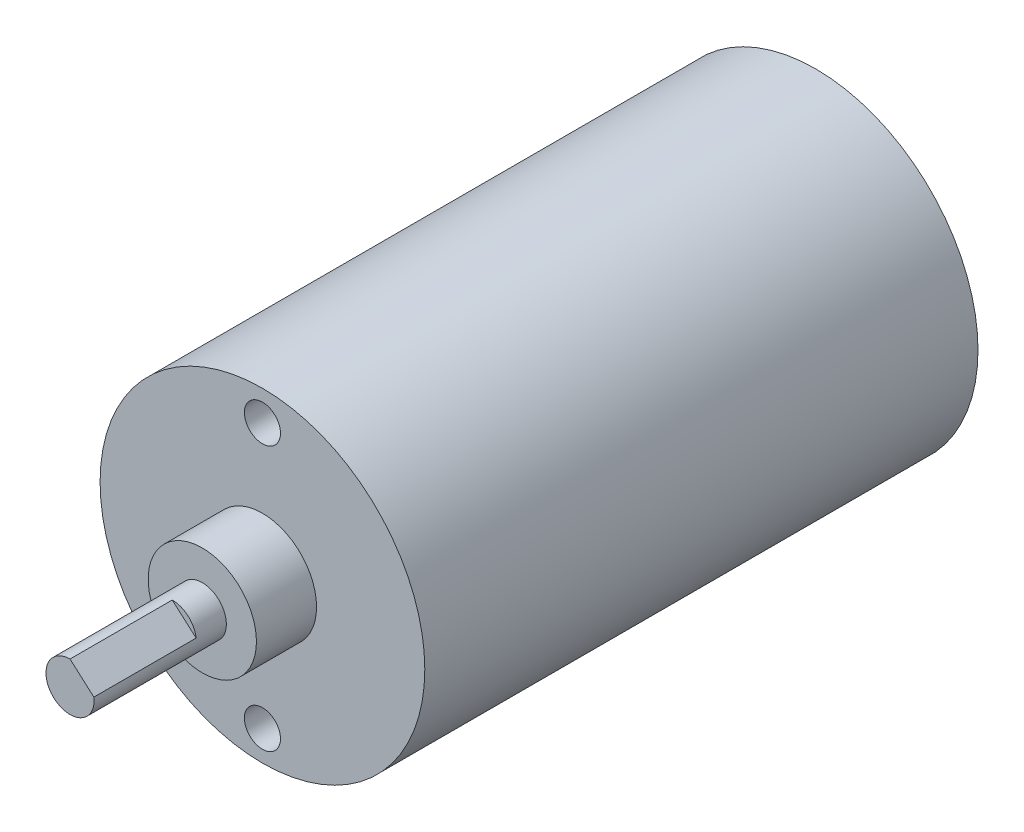
ISO-10303-21;
HEADER;
FILE_DESCRIPTION(('STEP AP214'),'2;1');
FILE_NAME('part.step','',(''),(''),'','','');
FILE_SCHEMA(('AUTOMOTIVE_DESIGN { 1 0 10303 214 1 1 1 1 }'));
ENDSEC;
DATA;
#1=APPLICATION_CONTEXT('core data for automotive mechanical design processes');
#2=APPLICATION_PROTOCOL_DEFINITION('international standard','automotive_design',2000,#1);
#3=PRODUCT_CONTEXT('',#1,'mechanical');
#4=PRODUCT('Part','Part','',(#3));
#5=PRODUCT_RELATED_PRODUCT_CATEGORY('part','',(#4));
#6=PRODUCT_DEFINITION_FORMATION('','',#4);
#7=PRODUCT_DEFINITION_CONTEXT('part definition',#1,'design');
#8=PRODUCT_DEFINITION('design','',#6,#7);
#9=PRODUCT_DEFINITION_SHAPE('','',#8);
#10=(LENGTH_UNIT() NAMED_UNIT(*) SI_UNIT(.MILLI.,.METRE.));
#11=(NAMED_UNIT(*) PLANE_ANGLE_UNIT() SI_UNIT($,.RADIAN.));
#12=(NAMED_UNIT(*) SI_UNIT($,.STERADIAN.) SOLID_ANGLE_UNIT());
#13=UNCERTAINTY_MEASURE_WITH_UNIT(LENGTH_MEASURE(1.E-05),#10,'distance_accuracy_value','');
#14=(GEOMETRIC_REPRESENTATION_CONTEXT(3) GLOBAL_UNCERTAINTY_ASSIGNED_CONTEXT((#13)) GLOBAL_UNIT_ASSIGNED_CONTEXT((#10,
#11,#12)) REPRESENTATION_CONTEXT('',''));
#15=CARTESIAN_POINT('',(0.,0.,0.));
#16=DIRECTION('',(0.,0.,1.));
#17=DIRECTION('',(1.,0.,0.));
#18=AXIS2_PLACEMENT_3D('',#15,#16,#17);
#19=CARTESIAN_POINT('',(0.,0.,53.5));
#20=DIRECTION('',(0.,0.,1.));
#21=DIRECTION('',(1.,0.,0.));
#22=AXIS2_PLACEMENT_3D('',#19,#20,#21);
#23=PLANE('',#22);
#24=CARTESIAN_POINT('',(0.,0.,53.5));
#25=DIRECTION('',(0.,0.,1.));
#26=DIRECTION('',(1.,0.,0.));
#27=AXIS2_PLACEMENT_3D('',#24,#25,#26);
#28=CIRCLE('',#27,2.);
#29=CARTESIAN_POINT('',(1.98431348329844,0.25,53.5));
#30=VERTEX_POINT('',#29);
#31=CARTESIAN_POINT('',(0.,2.,53.5));
#32=VERTEX_POINT('',#31);
#33=EDGE_CURVE('E80',#30,#32,#28,.T.);
#34=ORIENTED_EDGE('',*,*,#33,.T.);
#35=DIRECTION('',(0.75,-0.661437827766148,0.));
#36=VECTOR('',#35,1.);
#37=CARTESIAN_POINT('',(0.992156741649222,1.125,53.5));
#38=LINE('',#37,#36);
#39=EDGE_CURVE('E83',#32,#30,#38,.T.);
#40=ORIENTED_EDGE('',*,*,#39,.T.);
#41=EDGE_LOOP('',(#34,#40));
#42=FACE_BOUND('',#41,.T.);
#43=ADVANCED_FACE('F43',(#42),#23,.T.);
#44=CARTESIAN_POINT('',(0.,0.,46.));
#45=DIRECTION('',(0.,0.,-1.));
#46=DIRECTION('',(-1.,0.,0.));
#47=AXIS2_PLACEMENT_3D('',#44,#45,#46);
#48=CYLINDRICAL_SURFACE('',#47,13.5);
#49=CARTESIAN_POINT('',(0.,0.,46.));
#50=DIRECTION('',(0.,0.,1.));
#51=DIRECTION('',(1.,0.,0.));
#52=AXIS2_PLACEMENT_3D('',#49,#50,#51);
#53=CIRCLE('',#52,13.5);
#54=CARTESIAN_POINT('',(13.5,0.,46.));
#55=VERTEX_POINT('',#54);
#56=EDGE_CURVE('E100',#55,#55,#53,.T.);
#57=ORIENTED_EDGE('',*,*,#56,.F.);
#58=EDGE_LOOP('',(#57));
#59=FACE_BOUND('',#58,.T.);
#60=CARTESIAN_POINT('',(0.,0.,0.));
#61=DIRECTION('',(0.,0.,1.));
#62=DIRECTION('',(1.,0.,0.));
#63=AXIS2_PLACEMENT_3D('',#60,#61,#62);
#64=CIRCLE('',#63,13.5);
#65=CARTESIAN_POINT('',(13.5,0.,0.));
#66=VERTEX_POINT('',#65);
#67=EDGE_CURVE('E47',#66,#66,#64,.T.);
#68=ORIENTED_EDGE('',*,*,#67,.T.);
#69=EDGE_LOOP('',(#68));
#70=FACE_BOUND('',#69,.T.);
#71=ADVANCED_FACE('F45',(#59,#70),#48,.T.);
#72=CARTESIAN_POINT('',(0.,0.,46.));
#73=DIRECTION('',(0.,0.,1.));
#74=DIRECTION('',(1.,0.,0.));
#75=AXIS2_PLACEMENT_3D('',#72,#73,#74);
#76=PLANE('',#75);
#77=CARTESIAN_POINT('',(0.,11.,46.));
#78=DIRECTION('',(0.,0.,1.));
#79=DIRECTION('',(1.,0.,0.));
#80=AXIS2_PLACEMENT_3D('',#77,#78,#79);
#81=CIRCLE('',#80,1.5);
#82=CARTESIAN_POINT('',(1.5,11.,46.));
#83=VERTEX_POINT('',#82);
#84=EDGE_CURVE('E270',#83,#83,#81,.T.);
#85=ORIENTED_EDGE('',*,*,#84,.F.);
#86=EDGE_LOOP('',(#85));
#87=FACE_BOUND('',#86,.T.);
#88=CARTESIAN_POINT('',(0.,-11.,46.));
#89=DIRECTION('',(0.,0.,1.));
#90=DIRECTION('',(1.,0.,0.));
#91=AXIS2_PLACEMENT_3D('',#88,#89,#90);
#92=CIRCLE('',#91,1.5);
#93=CARTESIAN_POINT('',(1.5,-11.,46.));
#94=VERTEX_POINT('',#93);
#95=EDGE_CURVE('E274',#94,#94,#92,.T.);
#96=ORIENTED_EDGE('',*,*,#95,.F.);
#97=EDGE_LOOP('',(#96));
#98=FACE_BOUND('',#97,.T.);
#99=CARTESIAN_POINT('',(0.,0.,46.));
#100=DIRECTION('',(0.,0.,1.));
#101=DIRECTION('',(1.,0.,0.));
#102=AXIS2_PLACEMENT_3D('',#99,#100,#101);
#103=CIRCLE('',#102,4.5);
#104=CARTESIAN_POINT('',(4.5,0.,46.));
#105=VERTEX_POINT('',#104);
#106=EDGE_CURVE('E53',#105,#105,#103,.T.);
#107=ORIENTED_EDGE('',*,*,#106,.F.);
#108=EDGE_LOOP('',(#107));
#109=FACE_BOUND('',#108,.T.);
#110=ORIENTED_EDGE('',*,*,#56,.T.);
#111=EDGE_LOOP('',(#110));
#112=FACE_BOUND('',#111,.T.);
#113=ADVANCED_FACE('F113',(#87,#98,#109,#112),#76,.T.);
#114=CARTESIAN_POINT('',(0.,0.,0.));
#115=DIRECTION('',(0.,0.,1.));
#116=DIRECTION('',(1.,0.,0.));
#117=AXIS2_PLACEMENT_3D('',#114,#115,#116);
#118=PLANE('',#117);
#119=ORIENTED_EDGE('',*,*,#67,.F.);
#120=EDGE_LOOP('',(#119));
#121=FACE_BOUND('',#120,.T.);
#122=ADVANCED_FACE('F110',(#121),#118,.F.);
#123=CARTESIAN_POINT('',(0.,0.,51.));
#124=DIRECTION('',(0.,0.,-1.));
#125=DIRECTION('',(-1.,0.,0.));
#126=AXIS2_PLACEMENT_3D('',#123,#124,#125);
#127=CYLINDRICAL_SURFACE('',#126,4.5);
#128=CARTESIAN_POINT('',(0.,0.,51.));
#129=DIRECTION('',(0.,0.,1.));
#130=DIRECTION('',(1.,0.,0.));
#131=AXIS2_PLACEMENT_3D('',#128,#129,#130);
#132=CIRCLE('',#131,4.5);
#133=CARTESIAN_POINT('',(4.5,0.,51.));
#134=VERTEX_POINT('',#133);
#135=EDGE_CURVE('E91',#134,#134,#132,.T.);
#136=ORIENTED_EDGE('',*,*,#135,.F.);
#137=EDGE_LOOP('',(#136));
#138=FACE_BOUND('',#137,.T.);
#139=ORIENTED_EDGE('',*,*,#106,.T.);
#140=EDGE_LOOP('',(#139));
#141=FACE_BOUND('',#140,.T.);
#142=ADVANCED_FACE('F112',(#138,#141),#127,.T.);
#143=CARTESIAN_POINT('',(0.,0.,51.));
#144=DIRECTION('',(0.,0.,1.));
#145=DIRECTION('',(1.,0.,0.));
#146=AXIS2_PLACEMENT_3D('',#143,#144,#145);
#147=PLANE('',#146);
#148=CARTESIAN_POINT('',(0.,0.,51.));
#149=DIRECTION('',(0.,0.,1.));
#150=DIRECTION('',(1.,0.,0.));
#151=AXIS2_PLACEMENT_3D('',#148,#149,#150);
#152=CIRCLE('',#151,2.);
#153=CARTESIAN_POINT('',(2.,0.,51.));
#154=VERTEX_POINT('',#153);
#155=EDGE_CURVE('E11',#154,#154,#152,.T.);
#156=ORIENTED_EDGE('',*,*,#155,.F.);
#157=EDGE_LOOP('',(#156));
#158=FACE_BOUND('',#157,.T.);
#159=ORIENTED_EDGE('',*,*,#135,.T.);
#160=EDGE_LOOP('',(#159));
#161=FACE_BOUND('',#160,.T.);
#162=ADVANCED_FACE('F118',(#158,#161),#147,.T.);
#163=CARTESIAN_POINT('',(0.,0.,53.5));
#164=DIRECTION('',(0.,0.,-1.));
#165=DIRECTION('',(-1.,0.,0.));
#166=AXIS2_PLACEMENT_3D('',#163,#164,#165);
#167=CYLINDRICAL_SURFACE('',#166,2.);
#168=ORIENTED_EDGE('',*,*,#33,.F.);
#169=DIRECTION('',(0.,0.,-1.));
#170=VECTOR('',#169,1.);
#171=CARTESIAN_POINT('',(1.98431348329844,0.25,62.));
#172=LINE('',#171,#170);
#173=CARTESIAN_POINT('',(1.98431348329844,0.25,62.));
#174=VERTEX_POINT('',#173);
#175=EDGE_CURVE('E61',#174,#30,#172,.T.);
#176=ORIENTED_EDGE('',*,*,#175,.F.);
#177=CARTESIAN_POINT('',(0.,0.,62.));
#178=DIRECTION('',(0.,0.,1.));
#179=DIRECTION('',(1.,0.,0.));
#180=AXIS2_PLACEMENT_3D('',#177,#178,#179);
#181=CIRCLE('',#180,2.);
#182=CARTESIAN_POINT('',(0.,2.,62.));
#183=VERTEX_POINT('',#182);
#184=EDGE_CURVE('E69',#183,#174,#181,.T.);
#185=ORIENTED_EDGE('',*,*,#184,.F.);
#186=DIRECTION('',(0.,0.,-1.));
#187=VECTOR('',#186,1.);
#188=CARTESIAN_POINT('',(0.,2.,62.));
#189=LINE('',#188,#187);
#190=EDGE_CURVE('E76',#183,#32,#189,.T.);
#191=ORIENTED_EDGE('',*,*,#190,.T.);
#192=EDGE_LOOP('',(#168,#176,#185,#191));
#193=FACE_BOUND('',#192,.T.);
#194=ORIENTED_EDGE('',*,*,#155,.T.);
#195=EDGE_LOOP('',(#194));
#196=FACE_BOUND('',#195,.T.);
#197=ADVANCED_FACE('F77',(#193,#196),#167,.T.);
#198=CARTESIAN_POINT('',(0.992156741649222,1.125,62.));
#199=DIRECTION('',(0.661437827766148,0.75,0.));
#200=DIRECTION('',(-0.75,0.661437827766148,0.));
#201=AXIS2_PLACEMENT_3D('',#198,#199,#200);
#202=PLANE('',#201);
#203=ORIENTED_EDGE('',*,*,#39,.F.);
#204=ORIENTED_EDGE('',*,*,#190,.F.);
#205=DIRECTION('',(0.75,-0.661437827766148,0.));
#206=VECTOR('',#205,1.);
#207=CARTESIAN_POINT('',(0.992156741649222,1.125,62.));
#208=LINE('',#207,#206);
#209=EDGE_CURVE('E87',#183,#174,#208,.T.);
#210=ORIENTED_EDGE('',*,*,#209,.T.);
#211=ORIENTED_EDGE('',*,*,#175,.T.);
#212=EDGE_LOOP('',(#203,#204,#210,#211));
#213=FACE_BOUND('',#212,.T.);
#214=ADVANCED_FACE('F84',(#213),#202,.T.);
#215=CARTESIAN_POINT('',(0.,0.,62.));
#216=DIRECTION('',(0.,0.,1.));
#217=DIRECTION('',(1.,0.,0.));
#218=AXIS2_PLACEMENT_3D('',#215,#216,#217);
#219=PLANE('',#218);
#220=ORIENTED_EDGE('',*,*,#209,.F.);
#221=ORIENTED_EDGE('',*,*,#184,.T.);
#222=EDGE_LOOP('',(#220,#221));
#223=FACE_BOUND('',#222,.T.);
#224=ADVANCED_FACE('F156',(#223),#219,.T.);
#225=CARTESIAN_POINT('',(0.,-11.,36.));
#226=DIRECTION('',(0.,0.,1.));
#227=DIRECTION('',(1.,0.,0.));
#228=AXIS2_PLACEMENT_3D('',#225,#226,#227);
#229=CYLINDRICAL_SURFACE('',#228,1.5);
#230=CARTESIAN_POINT('',(0.,-11.,36.));
#231=DIRECTION('',(0.,0.,1.));
#232=DIRECTION('',(1.,0.,0.));
#233=AXIS2_PLACEMENT_3D('',#230,#231,#232);
#234=CIRCLE('',#233,1.5);
#235=CARTESIAN_POINT('',(1.5,-11.,36.));
#236=VERTEX_POINT('',#235);
#237=EDGE_CURVE('E280',#236,#236,#234,.T.);
#238=ORIENTED_EDGE('',*,*,#237,.F.);
#239=EDGE_LOOP('',(#238));
#240=FACE_BOUND('',#239,.T.);
#241=ORIENTED_EDGE('',*,*,#95,.T.);
#242=EDGE_LOOP('',(#241));
#243=FACE_BOUND('',#242,.T.);
#244=ADVANCED_FACE('F162',(#240,#243),#229,.F.);
#245=CARTESIAN_POINT('',(0.,-11.,36.));
#246=DIRECTION('',(0.,0.,1.));
#247=DIRECTION('',(1.,0.,0.));
#248=AXIS2_PLACEMENT_3D('',#245,#246,#247);
#249=PLANE('',#248);
#250=ORIENTED_EDGE('',*,*,#237,.T.);
#251=EDGE_LOOP('',(#250));
#252=FACE_BOUND('',#251,.T.);
#253=ADVANCED_FACE('F169',(#252),#249,.T.);
#254=CARTESIAN_POINT('',(0.,11.,36.));
#255=DIRECTION('',(0.,0.,1.));
#256=DIRECTION('',(1.,0.,0.));
#257=AXIS2_PLACEMENT_3D('',#254,#255,#256);
#258=CYLINDRICAL_SURFACE('',#257,1.5);
#259=CARTESIAN_POINT('',(0.,11.,36.));
#260=DIRECTION('',(0.,0.,1.));
#261=DIRECTION('',(1.,0.,0.));
#262=AXIS2_PLACEMENT_3D('',#259,#260,#261);
#263=CIRCLE('',#262,1.5);
#264=CARTESIAN_POINT('',(1.5,11.,36.));
#265=VERTEX_POINT('',#264);
#266=EDGE_CURVE('E88',#265,#265,#263,.T.);
#267=ORIENTED_EDGE('',*,*,#266,.F.);
#268=EDGE_LOOP('',(#267));
#269=FACE_BOUND('',#268,.T.);
#270=ORIENTED_EDGE('',*,*,#84,.T.);
#271=EDGE_LOOP('',(#270));
#272=FACE_BOUND('',#271,.T.);
#273=ADVANCED_FACE('F177',(#269,#272),#258,.F.);
#274=CARTESIAN_POINT('',(0.,11.,36.));
#275=DIRECTION('',(0.,0.,1.));
#276=DIRECTION('',(1.,0.,0.));
#277=AXIS2_PLACEMENT_3D('',#274,#275,#276);
#278=PLANE('',#277);
#279=ORIENTED_EDGE('',*,*,#266,.T.);
#280=EDGE_LOOP('',(#279));
#281=FACE_BOUND('',#280,.T.);
#282=ADVANCED_FACE('F185',(#281),#278,.T.);
#283=CLOSED_SHELL('',(#43,#71,#113,#122,#142,#162,#197,#214,#224,#244,#253,#273,#282));
#284=MANIFOLD_SOLID_BREP('B2',#283);
#285=ADVANCED_BREP_SHAPE_REPRESENTATION('',(#18,#284),#14);
#286=SHAPE_DEFINITION_REPRESENTATION(#9,#285);
ENDSEC;
END-ISO-10303-21;
